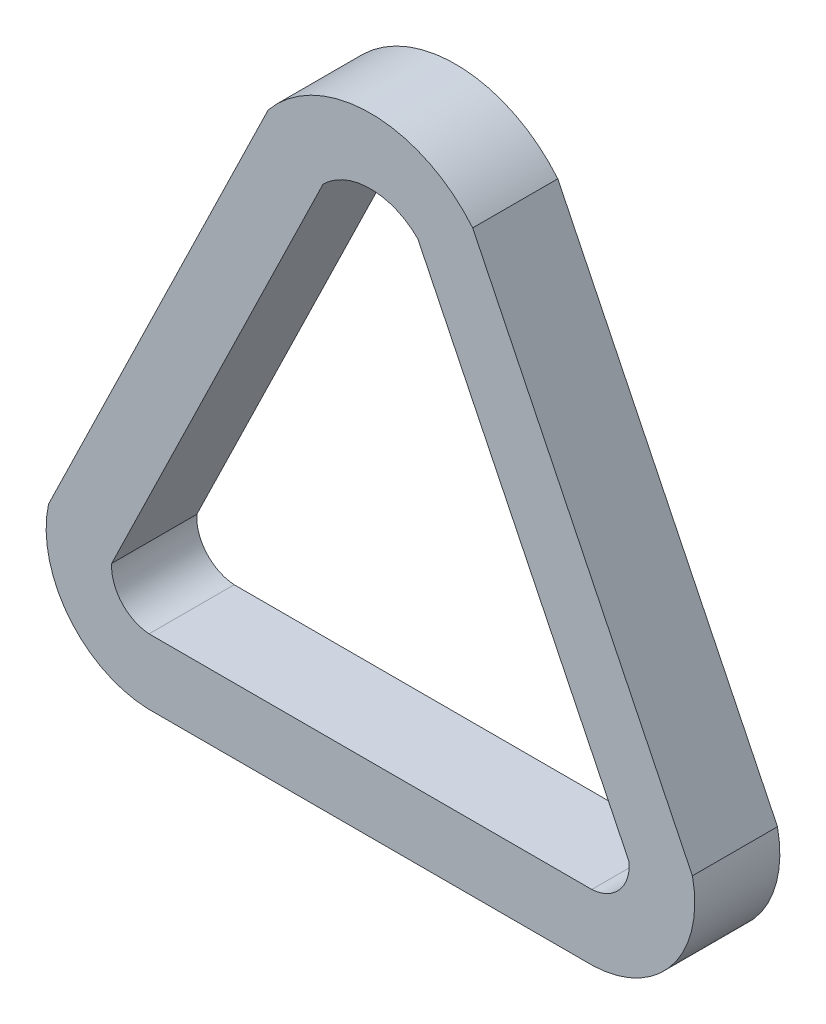
ISO-10303-21;
HEADER;
FILE_DESCRIPTION(('STEP AP214'),'2;1');
FILE_NAME('part.step','',(''),(''),'','','');
FILE_SCHEMA(('AUTOMOTIVE_DESIGN { 1 0 10303 214 1 1 1 1 }'));
ENDSEC;
DATA;
#1=APPLICATION_CONTEXT('core data for automotive mechanical design processes');
#2=APPLICATION_PROTOCOL_DEFINITION('international standard','automotive_design',2000,#1);
#3=PRODUCT_CONTEXT('',#1,'mechanical');
#4=PRODUCT('Part','Part','',(#3));
#5=PRODUCT_RELATED_PRODUCT_CATEGORY('part','',(#4));
#6=PRODUCT_DEFINITION_FORMATION('','',#4);
#7=PRODUCT_DEFINITION_CONTEXT('part definition',#1,'design');
#8=PRODUCT_DEFINITION('design','',#6,#7);
#9=PRODUCT_DEFINITION_SHAPE('','',#8);
#10=(LENGTH_UNIT() NAMED_UNIT(*) SI_UNIT(.MILLI.,.METRE.));
#11=(NAMED_UNIT(*) PLANE_ANGLE_UNIT() SI_UNIT($,.RADIAN.));
#12=(NAMED_UNIT(*) SI_UNIT($,.STERADIAN.) SOLID_ANGLE_UNIT());
#13=UNCERTAINTY_MEASURE_WITH_UNIT(LENGTH_MEASURE(1.E-05),#10,'distance_accuracy_value','');
#14=(GEOMETRIC_REPRESENTATION_CONTEXT(3) GLOBAL_UNCERTAINTY_ASSIGNED_CONTEXT((#13)) GLOBAL_UNIT_ASSIGNED_CONTEXT((#10,
#11,#12)) REPRESENTATION_CONTEXT('',''));
#15=CARTESIAN_POINT('',(0.,0.,0.));
#16=DIRECTION('',(0.,0.,1.));
#17=DIRECTION('',(1.,0.,0.));
#18=AXIS2_PLACEMENT_3D('',#15,#16,#17);
#19=CARTESIAN_POINT('',(0.,25.6865133113551,13.));
#20=DIRECTION('',(0.,0.,-1.));
#21=DIRECTION('',(-1.,0.,0.));
#22=AXIS2_PLACEMENT_3D('',#19,#20,#21);
#23=PLANE('',#22);
#24=CARTESIAN_POINT('',(0.,25.6865133113551,13.));
#25=DIRECTION('',(0.,0.,1.));
#26=DIRECTION('',(-1.,0.,0.));
#27=AXIS2_PLACEMENT_3D('',#24,#25,#26);
#28=CIRCLE('',#27,20.2285069738383);
#29=CARTESIAN_POINT('',(15.6158841337242,38.544843572813,13.));
#30=VERTEX_POINT('',#29);
#31=CARTESIAN_POINT('',(-15.6158841337242,38.544843572813,13.));
#32=VERTEX_POINT('',#31);
#33=EDGE_CURVE('E198',#30,#32,#28,.T.);
#34=ORIENTED_EDGE('',*,*,#33,.T.);
#35=DIRECTION('',(-0.43776006812057,-0.899091832216862,0.));
#36=VECTOR('',#35,1.);
#37=CARTESIAN_POINT('',(-15.6158841337242,38.544843572813,13.));
#38=LINE('',#37,#36);
#39=CARTESIAN_POINT('',(-49.1788732085081,-30.3883724500122,13.));
#40=VERTEX_POINT('',#39);
#41=EDGE_CURVE('E202',#32,#40,#38,.T.);
#42=ORIENTED_EDGE('',*,*,#41,.T.);
#43=CARTESIAN_POINT('',(-33.4437513606817,-33.7887226697353,13.));
#44=DIRECTION('',(0.,0.,1.));
#45=DIRECTION('',(1.,0.,0.));
#46=AXIS2_PLACEMENT_3D('',#43,#44,#45);
#47=CIRCLE('',#46,16.0983365967641);
#48=CARTESIAN_POINT('',(-34.0494199662542,-49.8756616800921,13.));
#49=VERTEX_POINT('',#48);
#50=EDGE_CURVE('E206',#40,#49,#47,.T.);
#51=ORIENTED_EDGE('',*,*,#50,.T.);
#52=DIRECTION('',(1.,0.,0.));
#53=VECTOR('',#52,1.);
#54=CARTESIAN_POINT('',(-34.0494199662542,-49.8756616800921,13.));
#55=LINE('',#54,#53);
#56=CARTESIAN_POINT('',(34.0494199662542,-49.8756616800921,13.));
#57=VERTEX_POINT('',#56);
#58=EDGE_CURVE('E209',#49,#57,#55,.T.);
#59=ORIENTED_EDGE('',*,*,#58,.T.);
#60=CARTESIAN_POINT('',(33.4437513606817,-33.7887226697353,13.));
#61=DIRECTION('',(0.,0.,1.));
#62=DIRECTION('',(1.,0.,0.));
#63=AXIS2_PLACEMENT_3D('',#60,#61,#62);
#64=CIRCLE('',#63,16.0983365967641);
#65=CARTESIAN_POINT('',(49.1788732085081,-30.3883724500121,13.));
#66=VERTEX_POINT('',#65);
#67=EDGE_CURVE('E212',#57,#66,#64,.T.);
#68=ORIENTED_EDGE('',*,*,#67,.T.);
#69=DIRECTION('',(-0.43776006812057,0.899091832216862,0.));
#70=VECTOR('',#69,1.);
#71=CARTESIAN_POINT('',(15.6158841337242,38.544843572813,13.));
#72=LINE('',#71,#70);
#73=EDGE_CURVE('E215',#66,#30,#72,.T.);
#74=ORIENTED_EDGE('',*,*,#73,.T.);
#75=EDGE_LOOP('',(#34,#42,#51,#59,#68,#74));
#76=FACE_BOUND('',#75,.T.);
#77=CARTESIAN_POINT('',(0.,25.6865133113551,13.));
#78=DIRECTION('',(0.,0.,1.));
#79=DIRECTION('',(-1.,0.,0.));
#80=AXIS2_PLACEMENT_3D('',#77,#78,#79);
#81=CIRCLE('',#80,10.2285069738383);
#82=CARTESIAN_POINT('',(7.23264664261497,32.9191599539701,13.));
#83=VERTEX_POINT('',#82);
#84=CARTESIAN_POINT('',(-7.23264664261497,32.9191599539701,13.));
#85=VERTEX_POINT('',#84);
#86=EDGE_CURVE('E129',#83,#85,#81,.T.);
#87=ORIENTED_EDGE('',*,*,#86,.F.);
#88=DIRECTION('',(-0.43776006812057,0.899091832216862,0.));
#89=VECTOR('',#88,1.);
#90=CARTESIAN_POINT('',(7.23264664261497,32.9191599539701,13.));
#91=LINE('',#90,#89);
#92=CARTESIAN_POINT('',(39.5306903710385,-33.4160529344074,13.));
#93=VERTEX_POINT('',#92);
#94=EDGE_CURVE('E164',#93,#83,#91,.T.);
#95=ORIENTED_EDGE('',*,*,#94,.F.);
#96=CARTESIAN_POINT('',(33.4437513606817,-33.7887226697353,13.));
#97=DIRECTION('',(0.,0.,1.));
#98=DIRECTION('',(1.,0.,0.));
#99=AXIS2_PLACEMENT_3D('',#96,#97,#98);
#100=CIRCLE('',#99,6.09833659676408);
#101=CARTESIAN_POINT('',(33.8164210960097,-39.8756616800921,13.));
#102=VERTEX_POINT('',#101);
#103=EDGE_CURVE('E161',#102,#93,#100,.T.);
#104=ORIENTED_EDGE('',*,*,#103,.F.);
#105=DIRECTION('',(1.,0.,0.));
#106=VECTOR('',#105,1.);
#107=CARTESIAN_POINT('',(-33.8164210960097,-39.8756616800921,13.));
#108=LINE('',#107,#106);
#109=CARTESIAN_POINT('',(-33.8164210960097,-39.8756616800921,13.));
#110=VERTEX_POINT('',#109);
#111=EDGE_CURVE('E156',#110,#102,#108,.T.);
#112=ORIENTED_EDGE('',*,*,#111,.F.);
#113=CARTESIAN_POINT('',(-33.4437513606817,-33.7887226697353,13.));
#114=DIRECTION('',(0.,0.,1.));
#115=DIRECTION('',(1.,0.,0.));
#116=AXIS2_PLACEMENT_3D('',#113,#114,#115);
#117=CIRCLE('',#116,6.0983365967641);
#118=CARTESIAN_POINT('',(-39.5306903710385,-33.4160529344074,13.));
#119=VERTEX_POINT('',#118);
#120=EDGE_CURVE('E152',#119,#110,#117,.T.);
#121=ORIENTED_EDGE('',*,*,#120,.F.);
#122=DIRECTION('',(-0.43776006812057,-0.899091832216862,0.));
#123=VECTOR('',#122,1.);
#124=CARTESIAN_POINT('',(-7.23264664261497,32.9191599539701,13.));
#125=LINE('',#124,#123);
#126=EDGE_CURVE('E138',#85,#119,#125,.T.);
#127=ORIENTED_EDGE('',*,*,#126,.F.);
#128=EDGE_LOOP('',(#87,#95,#104,#112,#121,#127));
#129=FACE_BOUND('',#128,.T.);
#130=ADVANCED_FACE('F39',(#76,#129),#23,.F.);
#131=CARTESIAN_POINT('',(0.,25.6865133113551,0.));
#132=DIRECTION('',(0.,0.,-1.));
#133=DIRECTION('',(-1.,0.,0.));
#134=AXIS2_PLACEMENT_3D('',#131,#132,#133);
#135=PLANE('',#134);
#136=CARTESIAN_POINT('',(0.,25.6865133113551,0.));
#137=DIRECTION('',(0.,0.,1.));
#138=DIRECTION('',(-1.,0.,0.));
#139=AXIS2_PLACEMENT_3D('',#136,#137,#138);
#140=CIRCLE('',#139,20.2285069738383);
#141=CARTESIAN_POINT('',(15.6158841337242,38.544843572813,0.));
#142=VERTEX_POINT('',#141);
#143=CARTESIAN_POINT('',(-15.6158841337242,38.544843572813,0.));
#144=VERTEX_POINT('',#143);
#145=EDGE_CURVE('E147',#142,#144,#140,.T.);
#146=ORIENTED_EDGE('',*,*,#145,.F.);
#147=DIRECTION('',(-0.43776006812057,0.899091832216862,0.));
#148=VECTOR('',#147,1.);
#149=CARTESIAN_POINT('',(15.6158841337242,38.544843572813,0.));
#150=LINE('',#149,#148);
#151=CARTESIAN_POINT('',(49.1788732085081,-30.3883724500121,0.));
#152=VERTEX_POINT('',#151);
#153=EDGE_CURVE('E203',#152,#142,#150,.T.);
#154=ORIENTED_EDGE('',*,*,#153,.F.);
#155=CARTESIAN_POINT('',(33.4437513606817,-33.7887226697353,0.));
#156=DIRECTION('',(0.,0.,1.));
#157=DIRECTION('',(1.,0.,0.));
#158=AXIS2_PLACEMENT_3D('',#155,#156,#157);
#159=CIRCLE('',#158,16.0983365967641);
#160=CARTESIAN_POINT('',(34.0494199662542,-49.8756616800921,0.));
#161=VERTEX_POINT('',#160);
#162=EDGE_CURVE('E231',#161,#152,#159,.T.);
#163=ORIENTED_EDGE('',*,*,#162,.F.);
#164=DIRECTION('',(1.,0.,0.));
#165=VECTOR('',#164,1.);
#166=CARTESIAN_POINT('',(-34.0494199662542,-49.8756616800921,0.));
#167=LINE('',#166,#165);
#168=CARTESIAN_POINT('',(-34.0494199662542,-49.8756616800921,0.));
#169=VERTEX_POINT('',#168);
#170=EDGE_CURVE('E228',#169,#161,#167,.T.);
#171=ORIENTED_EDGE('',*,*,#170,.F.);
#172=CARTESIAN_POINT('',(-33.4437513606817,-33.7887226697353,0.));
#173=DIRECTION('',(0.,0.,1.));
#174=DIRECTION('',(1.,0.,0.));
#175=AXIS2_PLACEMENT_3D('',#172,#173,#174);
#176=CIRCLE('',#175,16.0983365967641);
#177=CARTESIAN_POINT('',(-49.1788732085081,-30.3883724500122,0.));
#178=VERTEX_POINT('',#177);
#179=EDGE_CURVE('E225',#178,#169,#176,.T.);
#180=ORIENTED_EDGE('',*,*,#179,.F.);
#181=DIRECTION('',(-0.43776006812057,-0.899091832216862,0.));
#182=VECTOR('',#181,1.);
#183=CARTESIAN_POINT('',(-15.6158841337242,38.544843572813,0.));
#184=LINE('',#183,#182);
#185=EDGE_CURVE('E222',#144,#178,#184,.T.);
#186=ORIENTED_EDGE('',*,*,#185,.F.);
#187=EDGE_LOOP('',(#146,#154,#163,#171,#180,#186));
#188=FACE_BOUND('',#187,.T.);
#189=DIRECTION('',(-0.43776006812057,0.899091832216862,0.));
#190=VECTOR('',#189,1.);
#191=CARTESIAN_POINT('',(7.23264664261497,32.9191599539701,0.));
#192=LINE('',#191,#190);
#193=CARTESIAN_POINT('',(39.5306903710385,-33.4160529344074,0.));
#194=VERTEX_POINT('',#193);
#195=CARTESIAN_POINT('',(7.23264664261497,32.9191599539701,0.));
#196=VERTEX_POINT('',#195);
#197=EDGE_CURVE('E139',#194,#196,#192,.T.);
#198=ORIENTED_EDGE('',*,*,#197,.T.);
#199=CARTESIAN_POINT('',(0.,25.6865133113551,0.));
#200=DIRECTION('',(0.,0.,1.));
#201=DIRECTION('',(-1.,0.,0.));
#202=AXIS2_PLACEMENT_3D('',#199,#200,#201);
#203=CIRCLE('',#202,10.2285069738383);
#204=CARTESIAN_POINT('',(-7.23264664261497,32.9191599539701,0.));
#205=VERTEX_POINT('',#204);
#206=EDGE_CURVE('E63',#196,#205,#203,.T.);
#207=ORIENTED_EDGE('',*,*,#206,.T.);
#208=DIRECTION('',(-0.43776006812057,-0.899091832216862,0.));
#209=VECTOR('',#208,1.);
#210=CARTESIAN_POINT('',(-7.23264664261497,32.9191599539701,0.));
#211=LINE('',#210,#209);
#212=CARTESIAN_POINT('',(-39.5306903710385,-33.4160529344074,0.));
#213=VERTEX_POINT('',#212);
#214=EDGE_CURVE('E145',#205,#213,#211,.T.);
#215=ORIENTED_EDGE('',*,*,#214,.T.);
#216=CARTESIAN_POINT('',(-33.4437513606817,-33.7887226697353,0.));
#217=DIRECTION('',(0.,0.,1.));
#218=DIRECTION('',(1.,0.,0.));
#219=AXIS2_PLACEMENT_3D('',#216,#217,#218);
#220=CIRCLE('',#219,6.0983365967641);
#221=CARTESIAN_POINT('',(-33.8164210960097,-39.8756616800921,0.));
#222=VERTEX_POINT('',#221);
#223=EDGE_CURVE('E171',#213,#222,#220,.T.);
#224=ORIENTED_EDGE('',*,*,#223,.T.);
#225=DIRECTION('',(1.,0.,0.));
#226=VECTOR('',#225,1.);
#227=CARTESIAN_POINT('',(-33.8164210960097,-39.8756616800921,0.));
#228=LINE('',#227,#226);
#229=CARTESIAN_POINT('',(33.8164210960097,-39.8756616800921,0.));
#230=VERTEX_POINT('',#229);
#231=EDGE_CURVE('E175',#222,#230,#228,.T.);
#232=ORIENTED_EDGE('',*,*,#231,.T.);
#233=CARTESIAN_POINT('',(33.4437513606817,-33.7887226697353,0.));
#234=DIRECTION('',(0.,0.,1.));
#235=DIRECTION('',(1.,0.,0.));
#236=AXIS2_PLACEMENT_3D('',#233,#234,#235);
#237=CIRCLE('',#236,6.09833659676408);
#238=EDGE_CURVE('E179',#230,#194,#237,.T.);
#239=ORIENTED_EDGE('',*,*,#238,.T.);
#240=EDGE_LOOP('',(#198,#207,#215,#224,#232,#239));
#241=FACE_BOUND('',#240,.T.);
#242=ADVANCED_FACE('F262',(#188,#241),#135,.T.);
#243=CARTESIAN_POINT('',(0.,25.6865133113551,13.));
#244=DIRECTION('',(0.,0.,-1.));
#245=DIRECTION('',(-1.,0.,0.));
#246=AXIS2_PLACEMENT_3D('',#243,#244,#245);
#247=CYLINDRICAL_SURFACE('',#246,20.2285069738383);
#248=ORIENTED_EDGE('',*,*,#145,.T.);
#249=DIRECTION('',(0.,0.,-1.));
#250=VECTOR('',#249,1.);
#251=CARTESIAN_POINT('',(-15.6158841337242,38.544843572813,13.));
#252=LINE('',#251,#250);
#253=EDGE_CURVE('E11',#32,#144,#252,.T.);
#254=ORIENTED_EDGE('',*,*,#253,.F.);
#255=ORIENTED_EDGE('',*,*,#33,.F.);
#256=DIRECTION('',(0.,0.,-1.));
#257=VECTOR('',#256,1.);
#258=CARTESIAN_POINT('',(15.6158841337242,38.544843572813,13.));
#259=LINE('',#258,#257);
#260=EDGE_CURVE('E218',#30,#142,#259,.T.);
#261=ORIENTED_EDGE('',*,*,#260,.T.);
#262=EDGE_LOOP('',(#248,#254,#255,#261));
#263=FACE_BOUND('',#262,.T.);
#264=ADVANCED_FACE('F41',(#263),#247,.T.);
#265=CARTESIAN_POINT('',(-15.6158841337242,38.544843572813,13.));
#266=DIRECTION('',(0.899091832216862,-0.43776006812057,0.));
#267=DIRECTION('',(0.43776006812057,0.899091832216862,0.));
#268=AXIS2_PLACEMENT_3D('',#265,#266,#267);
#269=PLANE('',#268);
#270=ORIENTED_EDGE('',*,*,#185,.T.);
#271=DIRECTION('',(0.,0.,-1.));
#272=VECTOR('',#271,1.);
#273=CARTESIAN_POINT('',(-49.1788732085081,-30.3883724500122,13.));
#274=LINE('',#273,#272);
#275=EDGE_CURVE('E48',#40,#178,#274,.T.);
#276=ORIENTED_EDGE('',*,*,#275,.F.);
#277=ORIENTED_EDGE('',*,*,#41,.F.);
#278=ORIENTED_EDGE('',*,*,#253,.T.);
#279=EDGE_LOOP('',(#270,#276,#277,#278));
#280=FACE_BOUND('',#279,.T.);
#281=ADVANCED_FACE('F279',(#280),#269,.F.);
#282=CARTESIAN_POINT('',(-33.4437513606817,-33.7887226697353,13.));
#283=DIRECTION('',(0.,0.,-1.));
#284=DIRECTION('',(-1.,0.,0.));
#285=AXIS2_PLACEMENT_3D('',#282,#283,#284);
#286=CYLINDRICAL_SURFACE('',#285,16.0983365967641);
#287=ORIENTED_EDGE('',*,*,#179,.T.);
#288=DIRECTION('',(0.,0.,-1.));
#289=VECTOR('',#288,1.);
#290=CARTESIAN_POINT('',(-34.0494199662542,-49.8756616800921,13.));
#291=LINE('',#290,#289);
#292=EDGE_CURVE('E247',#49,#169,#291,.T.);
#293=ORIENTED_EDGE('',*,*,#292,.F.);
#294=ORIENTED_EDGE('',*,*,#50,.F.);
#295=ORIENTED_EDGE('',*,*,#275,.T.);
#296=EDGE_LOOP('',(#287,#293,#294,#295));
#297=FACE_BOUND('',#296,.T.);
#298=ADVANCED_FACE('F256',(#297),#286,.T.);
#299=CARTESIAN_POINT('',(-34.0494199662542,-49.8756616800921,13.));
#300=DIRECTION('',(0.,1.,0.));
#301=DIRECTION('',(0.,0.,1.));
#302=AXIS2_PLACEMENT_3D('',#299,#300,#301);
#303=PLANE('',#302);
#304=ORIENTED_EDGE('',*,*,#170,.T.);
#305=DIRECTION('',(0.,0.,-1.));
#306=VECTOR('',#305,1.);
#307=CARTESIAN_POINT('',(34.0494199662542,-49.8756616800921,13.));
#308=LINE('',#307,#306);
#309=EDGE_CURVE('E243',#57,#161,#308,.T.);
#310=ORIENTED_EDGE('',*,*,#309,.F.);
#311=ORIENTED_EDGE('',*,*,#58,.F.);
#312=ORIENTED_EDGE('',*,*,#292,.T.);
#313=EDGE_LOOP('',(#304,#310,#311,#312));
#314=FACE_BOUND('',#313,.T.);
#315=ADVANCED_FACE('F268',(#314),#303,.F.);
#316=CARTESIAN_POINT('',(33.4437513606817,-33.7887226697353,13.));
#317=DIRECTION('',(0.,0.,-1.));
#318=DIRECTION('',(-1.,0.,0.));
#319=AXIS2_PLACEMENT_3D('',#316,#317,#318);
#320=CYLINDRICAL_SURFACE('',#319,16.0983365967641);
#321=ORIENTED_EDGE('',*,*,#162,.T.);
#322=DIRECTION('',(0.,0.,-1.));
#323=VECTOR('',#322,1.);
#324=CARTESIAN_POINT('',(49.1788732085081,-30.3883724500121,13.));
#325=LINE('',#324,#323);
#326=EDGE_CURVE('E239',#66,#152,#325,.T.);
#327=ORIENTED_EDGE('',*,*,#326,.F.);
#328=ORIENTED_EDGE('',*,*,#67,.F.);
#329=ORIENTED_EDGE('',*,*,#309,.T.);
#330=EDGE_LOOP('',(#321,#327,#328,#329));
#331=FACE_BOUND('',#330,.T.);
#332=ADVANCED_FACE('F272',(#331),#320,.T.);
#333=CARTESIAN_POINT('',(15.6158841337242,38.544843572813,13.));
#334=DIRECTION('',(-0.899091832216862,-0.43776006812057,0.));
#335=DIRECTION('',(0.43776006812057,-0.899091832216862,0.));
#336=AXIS2_PLACEMENT_3D('',#333,#334,#335);
#337=PLANE('',#336);
#338=ORIENTED_EDGE('',*,*,#153,.T.);
#339=ORIENTED_EDGE('',*,*,#260,.F.);
#340=ORIENTED_EDGE('',*,*,#73,.F.);
#341=ORIENTED_EDGE('',*,*,#326,.T.);
#342=EDGE_LOOP('',(#338,#339,#340,#341));
#343=FACE_BOUND('',#342,.T.);
#344=ADVANCED_FACE('F282',(#343),#337,.F.);
#345=CARTESIAN_POINT('',(0.,25.6865133113551,13.));
#346=DIRECTION('',(0.,0.,-1.));
#347=DIRECTION('',(-1.,0.,0.));
#348=AXIS2_PLACEMENT_3D('',#345,#346,#347);
#349=CYLINDRICAL_SURFACE('',#348,10.2285069738383);
#350=ORIENTED_EDGE('',*,*,#206,.F.);
#351=DIRECTION('',(0.,0.,-1.));
#352=VECTOR('',#351,1.);
#353=CARTESIAN_POINT('',(7.23264664261497,32.9191599539701,13.));
#354=LINE('',#353,#352);
#355=EDGE_CURVE('E133',#83,#196,#354,.T.);
#356=ORIENTED_EDGE('',*,*,#355,.F.);
#357=ORIENTED_EDGE('',*,*,#86,.T.);
#358=DIRECTION('',(0.,0.,-1.));
#359=VECTOR('',#358,1.);
#360=CARTESIAN_POINT('',(-7.23264664261497,32.9191599539701,13.));
#361=LINE('',#360,#359);
#362=EDGE_CURVE('E132',#85,#205,#361,.T.);
#363=ORIENTED_EDGE('',*,*,#362,.T.);
#364=EDGE_LOOP('',(#350,#356,#357,#363));
#365=FACE_BOUND('',#364,.T.);
#366=ADVANCED_FACE('F131',(#365),#349,.F.);
#367=CARTESIAN_POINT('',(-7.23264664261497,32.9191599539701,13.));
#368=DIRECTION('',(0.899091832216862,-0.43776006812057,0.));
#369=DIRECTION('',(0.43776006812057,0.899091832216862,0.));
#370=AXIS2_PLACEMENT_3D('',#367,#368,#369);
#371=PLANE('',#370);
#372=ORIENTED_EDGE('',*,*,#214,.F.);
#373=ORIENTED_EDGE('',*,*,#362,.F.);
#374=ORIENTED_EDGE('',*,*,#126,.T.);
#375=DIRECTION('',(0.,0.,-1.));
#376=VECTOR('',#375,1.);
#377=CARTESIAN_POINT('',(-39.5306903710385,-33.4160529344074,13.));
#378=LINE('',#377,#376);
#379=EDGE_CURVE('E148',#119,#213,#378,.T.);
#380=ORIENTED_EDGE('',*,*,#379,.T.);
#381=EDGE_LOOP('',(#372,#373,#374,#380));
#382=FACE_BOUND('',#381,.T.);
#383=ADVANCED_FACE('F142',(#382),#371,.T.);
#384=CARTESIAN_POINT('',(-33.4437513606817,-33.7887226697353,13.));
#385=DIRECTION('',(0.,0.,-1.));
#386=DIRECTION('',(-1.,0.,0.));
#387=AXIS2_PLACEMENT_3D('',#384,#385,#386);
#388=CYLINDRICAL_SURFACE('',#387,6.0983365967641);
#389=ORIENTED_EDGE('',*,*,#223,.F.);
#390=ORIENTED_EDGE('',*,*,#379,.F.);
#391=ORIENTED_EDGE('',*,*,#120,.T.);
#392=DIRECTION('',(0.,0.,-1.));
#393=VECTOR('',#392,1.);
#394=CARTESIAN_POINT('',(-33.8164210960097,-39.8756616800921,13.));
#395=LINE('',#394,#393);
#396=EDGE_CURVE('E193',#110,#222,#395,.T.);
#397=ORIENTED_EDGE('',*,*,#396,.T.);
#398=EDGE_LOOP('',(#389,#390,#391,#397));
#399=FACE_BOUND('',#398,.T.);
#400=ADVANCED_FACE('F300',(#399),#388,.F.);
#401=CARTESIAN_POINT('',(-33.8164210960097,-39.8756616800921,13.));
#402=DIRECTION('',(0.,1.,0.));
#403=DIRECTION('',(0.,0.,1.));
#404=AXIS2_PLACEMENT_3D('',#401,#402,#403);
#405=PLANE('',#404);
#406=ORIENTED_EDGE('',*,*,#231,.F.);
#407=ORIENTED_EDGE('',*,*,#396,.F.);
#408=ORIENTED_EDGE('',*,*,#111,.T.);
#409=DIRECTION('',(0.,0.,-1.));
#410=VECTOR('',#409,1.);
#411=CARTESIAN_POINT('',(33.8164210960097,-39.8756616800921,13.));
#412=LINE('',#411,#410);
#413=EDGE_CURVE('E190',#102,#230,#412,.T.);
#414=ORIENTED_EDGE('',*,*,#413,.T.);
#415=EDGE_LOOP('',(#406,#407,#408,#414));
#416=FACE_BOUND('',#415,.T.);
#417=ADVANCED_FACE('F303',(#416),#405,.T.);
#418=CARTESIAN_POINT('',(33.4437513606817,-33.7887226697353,13.));
#419=DIRECTION('',(0.,0.,-1.));
#420=DIRECTION('',(-1.,0.,0.));
#421=AXIS2_PLACEMENT_3D('',#418,#419,#420);
#422=CYLINDRICAL_SURFACE('',#421,6.09833659676408);
#423=ORIENTED_EDGE('',*,*,#238,.F.);
#424=ORIENTED_EDGE('',*,*,#413,.F.);
#425=ORIENTED_EDGE('',*,*,#103,.T.);
#426=DIRECTION('',(0.,0.,-1.));
#427=VECTOR('',#426,1.);
#428=CARTESIAN_POINT('',(39.5306903710385,-33.4160529344074,13.));
#429=LINE('',#428,#427);
#430=EDGE_CURVE('E55',#93,#194,#429,.T.);
#431=ORIENTED_EDGE('',*,*,#430,.T.);
#432=EDGE_LOOP('',(#423,#424,#425,#431));
#433=FACE_BOUND('',#432,.T.);
#434=ADVANCED_FACE('F307',(#433),#422,.F.);
#435=CARTESIAN_POINT('',(7.23264664261497,32.9191599539701,13.));
#436=DIRECTION('',(-0.899091832216862,-0.43776006812057,0.));
#437=DIRECTION('',(0.43776006812057,-0.899091832216862,0.));
#438=AXIS2_PLACEMENT_3D('',#435,#436,#437);
#439=PLANE('',#438);
#440=ORIENTED_EDGE('',*,*,#197,.F.);
#441=ORIENTED_EDGE('',*,*,#430,.F.);
#442=ORIENTED_EDGE('',*,*,#94,.T.);
#443=ORIENTED_EDGE('',*,*,#355,.T.);
#444=EDGE_LOOP('',(#440,#441,#442,#443));
#445=FACE_BOUND('',#444,.T.);
#446=ADVANCED_FACE('F311',(#445),#439,.T.);
#447=CLOSED_SHELL('',(#130,#242,#264,#281,#298,#315,#332,#344,#366,#383,#400,#417,#434,#446));
#448=MANIFOLD_SOLID_BREP('B2',#447);
#449=ADVANCED_BREP_SHAPE_REPRESENTATION('',(#18,#448),#14);
#450=SHAPE_DEFINITION_REPRESENTATION(#9,#449);
ENDSEC;
END-ISO-10303-21;
